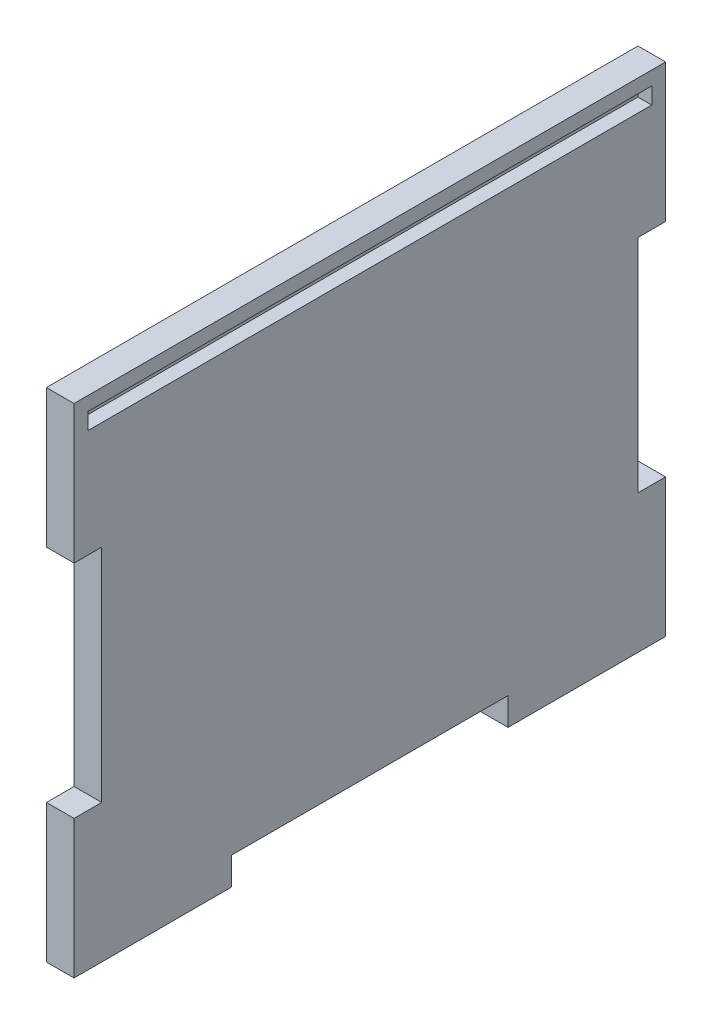
ISO-10303-21;
HEADER;
FILE_DESCRIPTION(('STEP AP214'),'2;1');
FILE_NAME('part.step','',(''),(''),'','','');
FILE_SCHEMA(('AUTOMOTIVE_DESIGN { 1 0 10303 214 1 1 1 1 }'));
ENDSEC;
DATA;
#1=APPLICATION_CONTEXT('core data for automotive mechanical design processes');
#2=APPLICATION_PROTOCOL_DEFINITION('international standard','automotive_design',2000,#1);
#3=PRODUCT_CONTEXT('',#1,'mechanical');
#4=PRODUCT('Part','Part','',(#3));
#5=PRODUCT_RELATED_PRODUCT_CATEGORY('part','',(#4));
#6=PRODUCT_DEFINITION_FORMATION('','',#4);
#7=PRODUCT_DEFINITION_CONTEXT('part definition',#1,'design');
#8=PRODUCT_DEFINITION('design','',#6,#7);
#9=PRODUCT_DEFINITION_SHAPE('','',#8);
#10=(LENGTH_UNIT() NAMED_UNIT(*) SI_UNIT(.MILLI.,.METRE.));
#11=(NAMED_UNIT(*) PLANE_ANGLE_UNIT() SI_UNIT($,.RADIAN.));
#12=(NAMED_UNIT(*) SI_UNIT($,.STERADIAN.) SOLID_ANGLE_UNIT());
#13=UNCERTAINTY_MEASURE_WITH_UNIT(LENGTH_MEASURE(1.E-05),#10,'distance_accuracy_value','');
#14=(GEOMETRIC_REPRESENTATION_CONTEXT(3) GLOBAL_UNCERTAINTY_ASSIGNED_CONTEXT((#13)) GLOBAL_UNIT_ASSIGNED_CONTEXT((#10,
#11,#12)) REPRESENTATION_CONTEXT('',''));
#15=CARTESIAN_POINT('',(0.,0.,0.));
#16=DIRECTION('',(0.,0.,1.));
#17=DIRECTION('',(1.,0.,0.));
#18=AXIS2_PLACEMENT_3D('',#15,#16,#17);
#19=CARTESIAN_POINT('',(5.,0.,0.));
#20=DIRECTION('',(0.,1.,0.));
#21=DIRECTION('',(0.,0.,1.));
#22=AXIS2_PLACEMENT_3D('',#19,#20,#21);
#23=PLANE('',#22);
#24=DIRECTION('',(0.,0.,-1.));
#25=VECTOR('',#24,1.);
#26=CARTESIAN_POINT('',(0.,0.,0.));
#27=LINE('',#26,#25);
#28=CARTESIAN_POINT('',(0.,0.,0.));
#29=VERTEX_POINT('',#28);
#30=CARTESIAN_POINT('',(0.,0.,-28.5));
#31=VERTEX_POINT('',#30);
#32=EDGE_CURVE('E304',#29,#31,#27,.T.);
#33=ORIENTED_EDGE('',*,*,#32,.T.);
#34=DIRECTION('',(1.,0.,0.));
#35=VECTOR('',#34,1.);
#36=CARTESIAN_POINT('',(0.,0.,-28.5));
#37=LINE('',#36,#35);
#38=CARTESIAN_POINT('',(5.,0.,-28.5));
#39=VERTEX_POINT('',#38);
#40=EDGE_CURVE('E217',#31,#39,#37,.T.);
#41=ORIENTED_EDGE('',*,*,#40,.T.);
#42=DIRECTION('',(0.,0.,-1.));
#43=VECTOR('',#42,1.);
#44=CARTESIAN_POINT('',(5.,0.,0.));
#45=LINE('',#44,#43);
#46=CARTESIAN_POINT('',(5.,0.,0.));
#47=VERTEX_POINT('',#46);
#48=EDGE_CURVE('E290',#47,#39,#45,.T.);
#49=ORIENTED_EDGE('',*,*,#48,.F.);
#50=DIRECTION('',(-1.,0.,0.));
#51=VECTOR('',#50,1.);
#52=CARTESIAN_POINT('',(5.,0.,0.));
#53=LINE('',#52,#51);
#54=EDGE_CURVE('E11',#47,#29,#53,.T.);
#55=ORIENTED_EDGE('',*,*,#54,.T.);
#56=EDGE_LOOP('',(#33,#41,#49,#55));
#57=FACE_BOUND('',#56,.T.);
#58=ADVANCED_FACE('F33',(#57),#23,.F.);
#59=CARTESIAN_POINT('',(5.,0.,-107.));
#60=DIRECTION('',(0.,0.,1.));
#61=DIRECTION('',(1.,0.,0.));
#62=AXIS2_PLACEMENT_3D('',#59,#60,#61);
#63=PLANE('',#62);
#64=DIRECTION('',(0.,1.,0.));
#65=VECTOR('',#64,1.);
#66=CARTESIAN_POINT('',(0.,0.,-107.));
#67=LINE('',#66,#65);
#68=CARTESIAN_POINT('',(0.,0.,-107.));
#69=VERTEX_POINT('',#68);
#70=CARTESIAN_POINT('',(0.,25.,-107.));
#71=VERTEX_POINT('',#70);
#72=EDGE_CURVE('E308',#69,#71,#67,.T.);
#73=ORIENTED_EDGE('',*,*,#72,.T.);
#74=DIRECTION('',(1.,0.,0.));
#75=VECTOR('',#74,1.);
#76=CARTESIAN_POINT('',(0.,25.,-107.));
#77=LINE('',#76,#75);
#78=CARTESIAN_POINT('',(5.,25.,-107.));
#79=VERTEX_POINT('',#78);
#80=EDGE_CURVE('E250',#71,#79,#77,.T.);
#81=ORIENTED_EDGE('',*,*,#80,.T.);
#82=DIRECTION('',(0.,1.,0.));
#83=VECTOR('',#82,1.);
#84=CARTESIAN_POINT('',(5.,0.,-107.));
#85=LINE('',#84,#83);
#86=CARTESIAN_POINT('',(5.,0.,-107.));
#87=VERTEX_POINT('',#86);
#88=EDGE_CURVE('E294',#87,#79,#85,.T.);
#89=ORIENTED_EDGE('',*,*,#88,.F.);
#90=DIRECTION('',(-1.,0.,0.));
#91=VECTOR('',#90,1.);
#92=CARTESIAN_POINT('',(5.,0.,-107.));
#93=LINE('',#92,#91);
#94=EDGE_CURVE('E41',#87,#69,#93,.T.);
#95=ORIENTED_EDGE('',*,*,#94,.T.);
#96=EDGE_LOOP('',(#73,#81,#89,#95));
#97=FACE_BOUND('',#96,.T.);
#98=ADVANCED_FACE('F322',(#97),#63,.F.);
#99=CARTESIAN_POINT('',(5.,0.,0.));
#100=DIRECTION('',(0.,0.,-1.));
#101=DIRECTION('',(-1.,0.,0.));
#102=AXIS2_PLACEMENT_3D('',#99,#100,#101);
#103=PLANE('',#102);
#104=DIRECTION('',(0.,-1.,0.));
#105=VECTOR('',#104,1.);
#106=CARTESIAN_POINT('',(0.,0.,0.));
#107=LINE('',#106,#105);
#108=CARTESIAN_POINT('',(0.,90.,0.));
#109=VERTEX_POINT('',#108);
#110=CARTESIAN_POINT('',(0.,65.,0.));
#111=VERTEX_POINT('',#110);
#112=EDGE_CURVE('E300',#109,#111,#107,.T.);
#113=ORIENTED_EDGE('',*,*,#112,.T.);
#114=DIRECTION('',(1.,0.,0.));
#115=VECTOR('',#114,1.);
#116=CARTESIAN_POINT('',(0.,65.,0.));
#117=LINE('',#116,#115);
#118=CARTESIAN_POINT('',(5.,65.,0.));
#119=VERTEX_POINT('',#118);
#120=EDGE_CURVE('E276',#111,#119,#117,.T.);
#121=ORIENTED_EDGE('',*,*,#120,.T.);
#122=DIRECTION('',(0.,-1.,0.));
#123=VECTOR('',#122,1.);
#124=CARTESIAN_POINT('',(5.,0.,0.));
#125=LINE('',#124,#123);
#126=CARTESIAN_POINT('',(5.,90.,0.));
#127=VERTEX_POINT('',#126);
#128=EDGE_CURVE('E285',#127,#119,#125,.T.);
#129=ORIENTED_EDGE('',*,*,#128,.F.);
#130=DIRECTION('',(-1.,0.,0.));
#131=VECTOR('',#130,1.);
#132=CARTESIAN_POINT('',(5.,90.,0.));
#133=LINE('',#132,#131);
#134=EDGE_CURVE('E299',#127,#109,#133,.T.);
#135=ORIENTED_EDGE('',*,*,#134,.T.);
#136=EDGE_LOOP('',(#113,#121,#129,#135));
#137=FACE_BOUND('',#136,.T.);
#138=ADVANCED_FACE('F365',(#137),#103,.F.);
#139=CARTESIAN_POINT('',(5.,25.,0.));
#140=VERTEX_POINT('',#139);
#141=EDGE_CURVE('E289',#140,#47,#125,.T.);
#142=ORIENTED_EDGE('',*,*,#141,.F.);
#143=DIRECTION('',(1.,0.,0.));
#144=VECTOR('',#143,1.);
#145=CARTESIAN_POINT('',(0.,25.,0.));
#146=LINE('',#145,#144);
#147=CARTESIAN_POINT('',(0.,25.,0.));
#148=VERTEX_POINT('',#147);
#149=EDGE_CURVE('E269',#148,#140,#146,.T.);
#150=ORIENTED_EDGE('',*,*,#149,.F.);
#151=EDGE_CURVE('E279',#148,#29,#107,.T.);
#152=ORIENTED_EDGE('',*,*,#151,.T.);
#153=ORIENTED_EDGE('',*,*,#54,.F.);
#154=EDGE_LOOP('',(#142,#150,#152,#153));
#155=FACE_BOUND('',#154,.T.);
#156=ADVANCED_FACE('F35',(#155),#103,.F.);
#157=CARTESIAN_POINT('',(5.,0.,-78.5));
#158=VERTEX_POINT('',#157);
#159=EDGE_CURVE('E288',#158,#87,#45,.T.);
#160=ORIENTED_EDGE('',*,*,#159,.F.);
#161=DIRECTION('',(1.,0.,0.));
#162=VECTOR('',#161,1.);
#163=CARTESIAN_POINT('',(0.,0.,-78.5));
#164=LINE('',#163,#162);
#165=CARTESIAN_POINT('',(0.,0.,-78.5));
#166=VERTEX_POINT('',#165);
#167=EDGE_CURVE('E229',#166,#158,#164,.T.);
#168=ORIENTED_EDGE('',*,*,#167,.F.);
#169=EDGE_CURVE('E303',#166,#69,#27,.T.);
#170=ORIENTED_EDGE('',*,*,#169,.T.);
#171=ORIENTED_EDGE('',*,*,#94,.F.);
#172=EDGE_LOOP('',(#160,#168,#170,#171));
#173=FACE_BOUND('',#172,.T.);
#174=ADVANCED_FACE('F338',(#173),#23,.F.);
#175=CARTESIAN_POINT('',(5.,65.,-107.));
#176=VERTEX_POINT('',#175);
#177=CARTESIAN_POINT('',(5.,90.,-107.));
#178=VERTEX_POINT('',#177);
#179=EDGE_CURVE('E293',#176,#178,#85,.T.);
#180=ORIENTED_EDGE('',*,*,#179,.F.);
#181=DIRECTION('',(1.,0.,0.));
#182=VECTOR('',#181,1.);
#183=CARTESIAN_POINT('',(0.,65.,-107.));
#184=LINE('',#183,#182);
#185=CARTESIAN_POINT('',(0.,65.,-107.));
#186=VERTEX_POINT('',#185);
#187=EDGE_CURVE('E243',#186,#176,#184,.T.);
#188=ORIENTED_EDGE('',*,*,#187,.F.);
#189=CARTESIAN_POINT('',(0.,90.,-107.));
#190=VERTEX_POINT('',#189);
#191=EDGE_CURVE('E307',#186,#190,#67,.T.);
#192=ORIENTED_EDGE('',*,*,#191,.T.);
#193=DIRECTION('',(-1.,0.,0.));
#194=VECTOR('',#193,1.);
#195=CARTESIAN_POINT('',(5.,90.,-107.));
#196=LINE('',#195,#194);
#197=EDGE_CURVE('E315',#178,#190,#196,.T.);
#198=ORIENTED_EDGE('',*,*,#197,.F.);
#199=EDGE_LOOP('',(#180,#188,#192,#198));
#200=FACE_BOUND('',#199,.T.);
#201=ADVANCED_FACE('F376',(#200),#63,.F.);
#202=CARTESIAN_POINT('',(5.,90.,0.));
#203=DIRECTION('',(0.,-1.,0.));
#204=DIRECTION('',(0.,0.,-1.));
#205=AXIS2_PLACEMENT_3D('',#202,#203,#204);
#206=PLANE('',#205);
#207=DIRECTION('',(0.,0.,1.));
#208=VECTOR('',#207,1.);
#209=CARTESIAN_POINT('',(0.,90.,0.));
#210=LINE('',#209,#208);
#211=EDGE_CURVE('E311',#190,#109,#210,.T.);
#212=ORIENTED_EDGE('',*,*,#211,.T.);
#213=ORIENTED_EDGE('',*,*,#134,.F.);
#214=DIRECTION('',(0.,0.,1.));
#215=VECTOR('',#214,1.);
#216=CARTESIAN_POINT('',(5.,90.,0.));
#217=LINE('',#216,#215);
#218=EDGE_CURVE('E297',#178,#127,#217,.T.);
#219=ORIENTED_EDGE('',*,*,#218,.F.);
#220=ORIENTED_EDGE('',*,*,#197,.T.);
#221=EDGE_LOOP('',(#212,#213,#219,#220));
#222=FACE_BOUND('',#221,.T.);
#223=ADVANCED_FACE('F370',(#222),#206,.F.);
#224=CARTESIAN_POINT('',(5.,0.,0.));
#225=DIRECTION('',(-1.,0.,0.));
#226=DIRECTION('',(0.,0.,1.));
#227=AXIS2_PLACEMENT_3D('',#224,#225,#226);
#228=PLANE('',#227);
#229=DIRECTION('',(0.,0.,-1.));
#230=VECTOR('',#229,1.);
#231=CARTESIAN_POINT('',(5.,84.5,-2.5));
#232=LINE('',#231,#230);
#233=CARTESIAN_POINT('',(5.,84.5,-2.5));
#234=VERTEX_POINT('',#233);
#235=CARTESIAN_POINT('',(5.,84.5,-104.5));
#236=VERTEX_POINT('',#235);
#237=EDGE_CURVE('E199',#234,#236,#232,.T.);
#238=ORIENTED_EDGE('',*,*,#237,.F.);
#239=DIRECTION('',(0.,-1.,0.));
#240=VECTOR('',#239,1.);
#241=CARTESIAN_POINT('',(5.,87.5,-2.5));
#242=LINE('',#241,#240);
#243=CARTESIAN_POINT('',(5.,87.5,-2.5));
#244=VERTEX_POINT('',#243);
#245=EDGE_CURVE('E48',#244,#234,#242,.T.);
#246=ORIENTED_EDGE('',*,*,#245,.F.);
#247=DIRECTION('',(0.,0.,1.));
#248=VECTOR('',#247,1.);
#249=CARTESIAN_POINT('',(5.,87.5,-2.5));
#250=LINE('',#249,#248);
#251=CARTESIAN_POINT('',(5.,87.5,-104.5));
#252=VERTEX_POINT('',#251);
#253=EDGE_CURVE('E190',#252,#244,#250,.T.);
#254=ORIENTED_EDGE('',*,*,#253,.F.);
#255=DIRECTION('',(0.,1.,0.));
#256=VECTOR('',#255,1.);
#257=CARTESIAN_POINT('',(5.,87.5,-104.5));
#258=LINE('',#257,#256);
#259=EDGE_CURVE('E193',#236,#252,#258,.T.);
#260=ORIENTED_EDGE('',*,*,#259,.F.);
#261=EDGE_LOOP('',(#238,#246,#254,#260));
#262=FACE_BOUND('',#261,.T.);
#263=ORIENTED_EDGE('',*,*,#48,.T.);
#264=DIRECTION('',(0.,-1.,0.));
#265=VECTOR('',#264,1.);
#266=CARTESIAN_POINT('',(5.,0.,-28.5));
#267=LINE('',#266,#265);
#268=CARTESIAN_POINT('',(5.,5.,-28.5));
#269=VERTEX_POINT('',#268);
#270=EDGE_CURVE('E205',#269,#39,#267,.T.);
#271=ORIENTED_EDGE('',*,*,#270,.F.);
#272=DIRECTION('',(0.,0.,1.));
#273=VECTOR('',#272,1.);
#274=CARTESIAN_POINT('',(5.,5.,-28.5));
#275=LINE('',#274,#273);
#276=CARTESIAN_POINT('',(5.,5.,-78.5));
#277=VERTEX_POINT('',#276);
#278=EDGE_CURVE('E213',#277,#269,#275,.T.);
#279=ORIENTED_EDGE('',*,*,#278,.F.);
#280=DIRECTION('',(0.,1.,0.));
#281=VECTOR('',#280,1.);
#282=CARTESIAN_POINT('',(5.,0.,-78.5));
#283=LINE('',#282,#281);
#284=EDGE_CURVE('E219',#158,#277,#283,.T.);
#285=ORIENTED_EDGE('',*,*,#284,.F.);
#286=ORIENTED_EDGE('',*,*,#159,.T.);
#287=ORIENTED_EDGE('',*,*,#88,.T.);
#288=DIRECTION('',(0.,0.,-1.));
#289=VECTOR('',#288,1.);
#290=CARTESIAN_POINT('',(5.,25.,-107.));
#291=LINE('',#290,#289);
#292=CARTESIAN_POINT('',(5.,25.,-102.));
#293=VERTEX_POINT('',#292);
#294=EDGE_CURVE('E237',#293,#79,#291,.T.);
#295=ORIENTED_EDGE('',*,*,#294,.F.);
#296=DIRECTION('',(0.,-1.,0.));
#297=VECTOR('',#296,1.);
#298=CARTESIAN_POINT('',(5.,65.,-102.));
#299=LINE('',#298,#297);
#300=CARTESIAN_POINT('',(5.,65.,-102.));
#301=VERTEX_POINT('',#300);
#302=EDGE_CURVE('E246',#301,#293,#299,.T.);
#303=ORIENTED_EDGE('',*,*,#302,.F.);
#304=DIRECTION('',(0.,0.,1.));
#305=VECTOR('',#304,1.);
#306=CARTESIAN_POINT('',(5.,65.,-107.));
#307=LINE('',#306,#305);
#308=EDGE_CURVE('E226',#176,#301,#307,.T.);
#309=ORIENTED_EDGE('',*,*,#308,.F.);
#310=ORIENTED_EDGE('',*,*,#179,.T.);
#311=ORIENTED_EDGE('',*,*,#218,.T.);
#312=ORIENTED_EDGE('',*,*,#128,.T.);
#313=DIRECTION('',(0.,0.,1.));
#314=VECTOR('',#313,1.);
#315=CARTESIAN_POINT('',(5.,65.,0.));
#316=LINE('',#315,#314);
#317=CARTESIAN_POINT('',(5.,65.,-4.99999999999998));
#318=VERTEX_POINT('',#317);
#319=EDGE_CURVE('E263',#318,#119,#316,.T.);
#320=ORIENTED_EDGE('',*,*,#319,.F.);
#321=DIRECTION('',(0.,1.,0.));
#322=VECTOR('',#321,1.);
#323=CARTESIAN_POINT('',(5.,65.,-4.99999999999998));
#324=LINE('',#323,#322);
#325=CARTESIAN_POINT('',(5.,25.,-4.99999999999999));
#326=VERTEX_POINT('',#325);
#327=EDGE_CURVE('E272',#326,#318,#324,.T.);
#328=ORIENTED_EDGE('',*,*,#327,.F.);
#329=DIRECTION('',(0.,0.,-1.));
#330=VECTOR('',#329,1.);
#331=CARTESIAN_POINT('',(5.,25.,0.));
#332=LINE('',#331,#330);
#333=EDGE_CURVE('E253',#140,#326,#332,.T.);
#334=ORIENTED_EDGE('',*,*,#333,.F.);
#335=ORIENTED_EDGE('',*,*,#141,.T.);
#336=EDGE_LOOP('',(#263,#271,#279,#285,#286,#287,#295,#303,#309,#310,#311,#312,#320,#328,#334,#335));
#337=FACE_BOUND('',#336,.T.);
#338=ADVANCED_FACE('F333',(#262,#337),#228,.F.);
#339=CARTESIAN_POINT('',(0.,0.,0.));
#340=DIRECTION('',(-1.,0.,0.));
#341=DIRECTION('',(0.,0.,1.));
#342=AXIS2_PLACEMENT_3D('',#339,#340,#341);
#343=PLANE('',#342);
#344=DIRECTION('',(0.,-1.,0.));
#345=VECTOR('',#344,1.);
#346=CARTESIAN_POINT('',(0.,0.,-28.5));
#347=LINE('',#346,#345);
#348=CARTESIAN_POINT('',(0.,5.,-28.5));
#349=VERTEX_POINT('',#348);
#350=EDGE_CURVE('E209',#349,#31,#347,.T.);
#351=ORIENTED_EDGE('',*,*,#350,.T.);
#352=ORIENTED_EDGE('',*,*,#32,.F.);
#353=ORIENTED_EDGE('',*,*,#151,.F.);
#354=DIRECTION('',(0.,0.,-1.));
#355=VECTOR('',#354,1.);
#356=CARTESIAN_POINT('',(0.,25.,0.));
#357=LINE('',#356,#355);
#358=CARTESIAN_POINT('',(0.,25.,-4.99999999999999));
#359=VERTEX_POINT('',#358);
#360=EDGE_CURVE('E259',#148,#359,#357,.T.);
#361=ORIENTED_EDGE('',*,*,#360,.T.);
#362=DIRECTION('',(0.,1.,0.));
#363=VECTOR('',#362,1.);
#364=CARTESIAN_POINT('',(0.,65.,-4.99999999999998));
#365=LINE('',#364,#363);
#366=CARTESIAN_POINT('',(0.,65.,-4.99999999999998));
#367=VERTEX_POINT('',#366);
#368=EDGE_CURVE('E262',#359,#367,#365,.T.);
#369=ORIENTED_EDGE('',*,*,#368,.T.);
#370=DIRECTION('',(0.,0.,1.));
#371=VECTOR('',#370,1.);
#372=CARTESIAN_POINT('',(0.,65.,0.));
#373=LINE('',#372,#371);
#374=EDGE_CURVE('E266',#367,#111,#373,.T.);
#375=ORIENTED_EDGE('',*,*,#374,.T.);
#376=ORIENTED_EDGE('',*,*,#112,.F.);
#377=ORIENTED_EDGE('',*,*,#211,.F.);
#378=ORIENTED_EDGE('',*,*,#191,.F.);
#379=DIRECTION('',(0.,0.,1.));
#380=VECTOR('',#379,1.);
#381=CARTESIAN_POINT('',(0.,65.,-107.));
#382=LINE('',#381,#380);
#383=CARTESIAN_POINT('',(0.,65.,-102.));
#384=VERTEX_POINT('',#383);
#385=EDGE_CURVE('E233',#186,#384,#382,.T.);
#386=ORIENTED_EDGE('',*,*,#385,.T.);
#387=DIRECTION('',(0.,-1.,0.));
#388=VECTOR('',#387,1.);
#389=CARTESIAN_POINT('',(0.,65.,-102.));
#390=LINE('',#389,#388);
#391=CARTESIAN_POINT('',(0.,25.,-102.));
#392=VERTEX_POINT('',#391);
#393=EDGE_CURVE('E236',#384,#392,#390,.T.);
#394=ORIENTED_EDGE('',*,*,#393,.T.);
#395=DIRECTION('',(0.,0.,-1.));
#396=VECTOR('',#395,1.);
#397=CARTESIAN_POINT('',(0.,25.,-107.));
#398=LINE('',#397,#396);
#399=EDGE_CURVE('E240',#392,#71,#398,.T.);
#400=ORIENTED_EDGE('',*,*,#399,.T.);
#401=ORIENTED_EDGE('',*,*,#72,.F.);
#402=ORIENTED_EDGE('',*,*,#169,.F.);
#403=DIRECTION('',(0.,1.,0.));
#404=VECTOR('',#403,1.);
#405=CARTESIAN_POINT('',(0.,0.,-78.5));
#406=LINE('',#405,#404);
#407=CARTESIAN_POINT('',(0.,5.,-78.5));
#408=VERTEX_POINT('',#407);
#409=EDGE_CURVE('E212',#166,#408,#406,.T.);
#410=ORIENTED_EDGE('',*,*,#409,.T.);
#411=DIRECTION('',(0.,0.,1.));
#412=VECTOR('',#411,1.);
#413=CARTESIAN_POINT('',(0.,5.,-28.5));
#414=LINE('',#413,#412);
#415=EDGE_CURVE('E56',#408,#349,#414,.T.);
#416=ORIENTED_EDGE('',*,*,#415,.T.);
#417=EDGE_LOOP('',(#351,#352,#353,#361,#369,#375,#376,#377,#378,#386,#394,#400,#401,#402,#410,#416));
#418=FACE_BOUND('',#417,.T.);
#419=ADVANCED_FACE('F327',(#418),#343,.T.);
#420=CARTESIAN_POINT('',(0.,65.,0.));
#421=DIRECTION('',(0.,1.,0.));
#422=DIRECTION('',(0.,0.,1.));
#423=AXIS2_PLACEMENT_3D('',#420,#421,#422);
#424=PLANE('',#423);
#425=ORIENTED_EDGE('',*,*,#319,.T.);
#426=ORIENTED_EDGE('',*,*,#120,.F.);
#427=ORIENTED_EDGE('',*,*,#374,.F.);
#428=DIRECTION('',(1.,0.,0.));
#429=VECTOR('',#428,1.);
#430=CARTESIAN_POINT('',(0.,65.,-4.99999999999998));
#431=LINE('',#430,#429);
#432=EDGE_CURVE('E280',#367,#318,#431,.T.);
#433=ORIENTED_EDGE('',*,*,#432,.T.);
#434=EDGE_LOOP('',(#425,#426,#427,#433));
#435=FACE_BOUND('',#434,.T.);
#436=ADVANCED_FACE('F361',(#435),#424,.F.);
#437=CARTESIAN_POINT('',(0.,65.,-4.99999999999998));
#438=DIRECTION('',(0.,0.,-1.));
#439=DIRECTION('',(0.,1.,0.));
#440=AXIS2_PLACEMENT_3D('',#437,#438,#439);
#441=PLANE('',#440);
#442=ORIENTED_EDGE('',*,*,#327,.T.);
#443=ORIENTED_EDGE('',*,*,#432,.F.);
#444=ORIENTED_EDGE('',*,*,#368,.F.);
#445=DIRECTION('',(1.,0.,0.));
#446=VECTOR('',#445,1.);
#447=CARTESIAN_POINT('',(0.,25.,-4.99999999999999));
#448=LINE('',#447,#446);
#449=EDGE_CURVE('E282',#359,#326,#448,.T.);
#450=ORIENTED_EDGE('',*,*,#449,.T.);
#451=EDGE_LOOP('',(#442,#443,#444,#450));
#452=FACE_BOUND('',#451,.T.);
#453=ADVANCED_FACE('F357',(#452),#441,.F.);
#454=CARTESIAN_POINT('',(0.,25.,0.));
#455=DIRECTION('',(0.,-1.,0.));
#456=DIRECTION('',(0.,0.,-1.));
#457=AXIS2_PLACEMENT_3D('',#454,#455,#456);
#458=PLANE('',#457);
#459=ORIENTED_EDGE('',*,*,#333,.T.);
#460=ORIENTED_EDGE('',*,*,#449,.F.);
#461=ORIENTED_EDGE('',*,*,#360,.F.);
#462=ORIENTED_EDGE('',*,*,#149,.T.);
#463=EDGE_LOOP('',(#459,#460,#461,#462));
#464=FACE_BOUND('',#463,.T.);
#465=ADVANCED_FACE('F353',(#464),#458,.F.);
#466=CARTESIAN_POINT('',(0.,25.,-107.));
#467=DIRECTION('',(0.,-1.,0.));
#468=DIRECTION('',(0.,0.,-1.));
#469=AXIS2_PLACEMENT_3D('',#466,#467,#468);
#470=PLANE('',#469);
#471=ORIENTED_EDGE('',*,*,#294,.T.);
#472=ORIENTED_EDGE('',*,*,#80,.F.);
#473=ORIENTED_EDGE('',*,*,#399,.F.);
#474=DIRECTION('',(1.,0.,0.));
#475=VECTOR('',#474,1.);
#476=CARTESIAN_POINT('',(0.,25.,-102.));
#477=LINE('',#476,#475);
#478=EDGE_CURVE('E254',#392,#293,#477,.T.);
#479=ORIENTED_EDGE('',*,*,#478,.T.);
#480=EDGE_LOOP('',(#471,#472,#473,#479));
#481=FACE_BOUND('',#480,.T.);
#482=ADVANCED_FACE('F330',(#481),#470,.F.);
#483=CARTESIAN_POINT('',(0.,65.,-102.));
#484=DIRECTION('',(0.,0.,1.));
#485=DIRECTION('',(1.,0.,0.));
#486=AXIS2_PLACEMENT_3D('',#483,#484,#485);
#487=PLANE('',#486);
#488=ORIENTED_EDGE('',*,*,#302,.T.);
#489=ORIENTED_EDGE('',*,*,#478,.F.);
#490=ORIENTED_EDGE('',*,*,#393,.F.);
#491=DIRECTION('',(1.,0.,0.));
#492=VECTOR('',#491,1.);
#493=CARTESIAN_POINT('',(0.,65.,-102.));
#494=LINE('',#493,#492);
#495=EDGE_CURVE('E256',#384,#301,#494,.T.);
#496=ORIENTED_EDGE('',*,*,#495,.T.);
#497=EDGE_LOOP('',(#488,#489,#490,#496));
#498=FACE_BOUND('',#497,.T.);
#499=ADVANCED_FACE('F382',(#498),#487,.F.);
#500=CARTESIAN_POINT('',(0.,65.,-107.));
#501=DIRECTION('',(0.,1.,0.));
#502=DIRECTION('',(0.,0.,1.));
#503=AXIS2_PLACEMENT_3D('',#500,#501,#502);
#504=PLANE('',#503);
#505=ORIENTED_EDGE('',*,*,#308,.T.);
#506=ORIENTED_EDGE('',*,*,#495,.F.);
#507=ORIENTED_EDGE('',*,*,#385,.F.);
#508=ORIENTED_EDGE('',*,*,#187,.T.);
#509=EDGE_LOOP('',(#505,#506,#507,#508));
#510=FACE_BOUND('',#509,.T.);
#511=ADVANCED_FACE('F379',(#510),#504,.F.);
#512=CARTESIAN_POINT('',(0.,0.,-28.5));
#513=DIRECTION('',(0.,0.,1.));
#514=DIRECTION('',(1.,0.,0.));
#515=AXIS2_PLACEMENT_3D('',#512,#513,#514);
#516=PLANE('',#515);
#517=ORIENTED_EDGE('',*,*,#270,.T.);
#518=ORIENTED_EDGE('',*,*,#40,.F.);
#519=ORIENTED_EDGE('',*,*,#350,.F.);
#520=DIRECTION('',(1.,0.,0.));
#521=VECTOR('',#520,1.);
#522=CARTESIAN_POINT('',(0.,5.,-28.5));
#523=LINE('',#522,#521);
#524=EDGE_CURVE('E224',#349,#269,#523,.T.);
#525=ORIENTED_EDGE('',*,*,#524,.T.);
#526=EDGE_LOOP('',(#517,#518,#519,#525));
#527=FACE_BOUND('',#526,.T.);
#528=ADVANCED_FACE('F389',(#527),#516,.F.);
#529=CARTESIAN_POINT('',(0.,5.,-28.5));
#530=DIRECTION('',(0.,1.,0.));
#531=DIRECTION('',(0.,0.,1.));
#532=AXIS2_PLACEMENT_3D('',#529,#530,#531);
#533=PLANE('',#532);
#534=ORIENTED_EDGE('',*,*,#278,.T.);
#535=ORIENTED_EDGE('',*,*,#524,.F.);
#536=ORIENTED_EDGE('',*,*,#415,.F.);
#537=DIRECTION('',(1.,0.,0.));
#538=VECTOR('',#537,1.);
#539=CARTESIAN_POINT('',(0.,5.,-78.5));
#540=LINE('',#539,#538);
#541=EDGE_CURVE('E227',#408,#277,#540,.T.);
#542=ORIENTED_EDGE('',*,*,#541,.T.);
#543=EDGE_LOOP('',(#534,#535,#536,#542));
#544=FACE_BOUND('',#543,.T.);
#545=ADVANCED_FACE('F470',(#544),#533,.F.);
#546=CARTESIAN_POINT('',(0.,0.,-78.5));
#547=DIRECTION('',(0.,0.,-1.));
#548=DIRECTION('',(-1.,0.,0.));
#549=AXIS2_PLACEMENT_3D('',#546,#547,#548);
#550=PLANE('',#549);
#551=ORIENTED_EDGE('',*,*,#284,.T.);
#552=ORIENTED_EDGE('',*,*,#541,.F.);
#553=ORIENTED_EDGE('',*,*,#409,.F.);
#554=ORIENTED_EDGE('',*,*,#167,.T.);
#555=EDGE_LOOP('',(#551,#552,#553,#554));
#556=FACE_BOUND('',#555,.T.);
#557=ADVANCED_FACE('F340',(#556),#550,.F.);
#558=CARTESIAN_POINT('',(2.5,87.5,-2.5));
#559=DIRECTION('',(0.,0.,1.));
#560=DIRECTION('',(0.,-1.,0.));
#561=AXIS2_PLACEMENT_3D('',#558,#559,#560);
#562=PLANE('',#561);
#563=ORIENTED_EDGE('',*,*,#245,.T.);
#564=DIRECTION('',(1.,0.,0.));
#565=VECTOR('',#564,1.);
#566=CARTESIAN_POINT('',(2.5,84.5,-2.5));
#567=LINE('',#566,#565);
#568=CARTESIAN_POINT('',(2.5,84.5,-2.5));
#569=VERTEX_POINT('',#568);
#570=EDGE_CURVE('E168',#569,#234,#567,.T.);
#571=ORIENTED_EDGE('',*,*,#570,.F.);
#572=DIRECTION('',(0.,-1.,0.));
#573=VECTOR('',#572,1.);
#574=CARTESIAN_POINT('',(2.5,87.5,-2.5));
#575=LINE('',#574,#573);
#576=CARTESIAN_POINT('',(2.5,87.5,-2.5));
#577=VERTEX_POINT('',#576);
#578=EDGE_CURVE('E172',#577,#569,#575,.T.);
#579=ORIENTED_EDGE('',*,*,#578,.F.);
#580=DIRECTION('',(1.,0.,0.));
#581=VECTOR('',#580,1.);
#582=CARTESIAN_POINT('',(2.5,87.5,-2.5));
#583=LINE('',#582,#581);
#584=EDGE_CURVE('E203',#577,#244,#583,.T.);
#585=ORIENTED_EDGE('',*,*,#584,.T.);
#586=EDGE_LOOP('',(#563,#571,#579,#585));
#587=FACE_BOUND('',#586,.T.);
#588=ADVANCED_FACE('F170',(#587),#562,.F.);
#589=CARTESIAN_POINT('',(2.5,87.5,-2.5));
#590=DIRECTION('',(0.,1.,0.));
#591=DIRECTION('',(0.,0.,1.));
#592=AXIS2_PLACEMENT_3D('',#589,#590,#591);
#593=PLANE('',#592);
#594=ORIENTED_EDGE('',*,*,#253,.T.);
#595=ORIENTED_EDGE('',*,*,#584,.F.);
#596=DIRECTION('',(0.,0.,1.));
#597=VECTOR('',#596,1.);
#598=CARTESIAN_POINT('',(2.5,87.5,-2.5));
#599=LINE('',#598,#597);
#600=CARTESIAN_POINT('',(2.5,87.5,-104.5));
#601=VERTEX_POINT('',#600);
#602=EDGE_CURVE('E178',#601,#577,#599,.T.);
#603=ORIENTED_EDGE('',*,*,#602,.F.);
#604=DIRECTION('',(1.,0.,0.));
#605=VECTOR('',#604,1.);
#606=CARTESIAN_POINT('',(2.5,87.5,-104.5));
#607=LINE('',#606,#605);
#608=EDGE_CURVE('E206',#601,#252,#607,.T.);
#609=ORIENTED_EDGE('',*,*,#608,.T.);
#610=EDGE_LOOP('',(#594,#595,#603,#609));
#611=FACE_BOUND('',#610,.T.);
#612=ADVANCED_FACE('F502',(#611),#593,.F.);
#613=CARTESIAN_POINT('',(2.5,87.5,-104.5));
#614=DIRECTION('',(0.,0.,-1.));
#615=DIRECTION('',(-1.,0.,0.));
#616=AXIS2_PLACEMENT_3D('',#613,#614,#615);
#617=PLANE('',#616);
#618=ORIENTED_EDGE('',*,*,#259,.T.);
#619=ORIENTED_EDGE('',*,*,#608,.F.);
#620=DIRECTION('',(0.,1.,0.));
#621=VECTOR('',#620,1.);
#622=CARTESIAN_POINT('',(2.5,87.5,-104.5));
#623=LINE('',#622,#621);
#624=CARTESIAN_POINT('',(2.5,84.5,-104.5));
#625=VERTEX_POINT('',#624);
#626=EDGE_CURVE('E186',#625,#601,#623,.T.);
#627=ORIENTED_EDGE('',*,*,#626,.F.);
#628=DIRECTION('',(1.,0.,0.));
#629=VECTOR('',#628,1.);
#630=CARTESIAN_POINT('',(2.5,84.5,-104.5));
#631=LINE('',#630,#629);
#632=EDGE_CURVE('E177',#625,#236,#631,.T.);
#633=ORIENTED_EDGE('',*,*,#632,.T.);
#634=EDGE_LOOP('',(#618,#619,#627,#633));
#635=FACE_BOUND('',#634,.T.);
#636=ADVANCED_FACE('F511',(#635),#617,.F.);
#637=CARTESIAN_POINT('',(2.5,84.5,-2.5));
#638=DIRECTION('',(0.,-1.,0.));
#639=DIRECTION('',(0.,0.,-1.));
#640=AXIS2_PLACEMENT_3D('',#637,#638,#639);
#641=PLANE('',#640);
#642=ORIENTED_EDGE('',*,*,#237,.T.);
#643=ORIENTED_EDGE('',*,*,#632,.F.);
#644=DIRECTION('',(0.,0.,-1.));
#645=VECTOR('',#644,1.);
#646=CARTESIAN_POINT('',(2.5,84.5,-2.5));
#647=LINE('',#646,#645);
#648=EDGE_CURVE('E181',#569,#625,#647,.T.);
#649=ORIENTED_EDGE('',*,*,#648,.F.);
#650=ORIENTED_EDGE('',*,*,#570,.T.);
#651=EDGE_LOOP('',(#642,#643,#649,#650));
#652=FACE_BOUND('',#651,.T.);
#653=ADVANCED_FACE('F182',(#652),#641,.F.);
#654=CARTESIAN_POINT('',(2.5,0.,0.));
#655=DIRECTION('',(1.,0.,0.));
#656=DIRECTION('',(0.,0.,-1.));
#657=AXIS2_PLACEMENT_3D('',#654,#655,#656);
#658=PLANE('',#657);
#659=ORIENTED_EDGE('',*,*,#578,.T.);
#660=ORIENTED_EDGE('',*,*,#648,.T.);
#661=ORIENTED_EDGE('',*,*,#626,.T.);
#662=ORIENTED_EDGE('',*,*,#602,.T.);
#663=EDGE_LOOP('',(#659,#660,#661,#662));
#664=FACE_BOUND('',#663,.T.);
#665=ADVANCED_FACE('F188',(#664),#658,.T.);
#666=CLOSED_SHELL('',(#58,#98,#138,#156,#174,#201,#223,#338,#419,#436,#453,#465,#482,#499,#511,
#528,#545,#557,#588,#612,#636,#653,#665));
#667=MANIFOLD_SOLID_BREP('B2',#666);
#668=ADVANCED_BREP_SHAPE_REPRESENTATION('',(#18,#667),#14);
#669=SHAPE_DEFINITION_REPRESENTATION(#9,#668);
ENDSEC;
END-ISO-10303-21;
